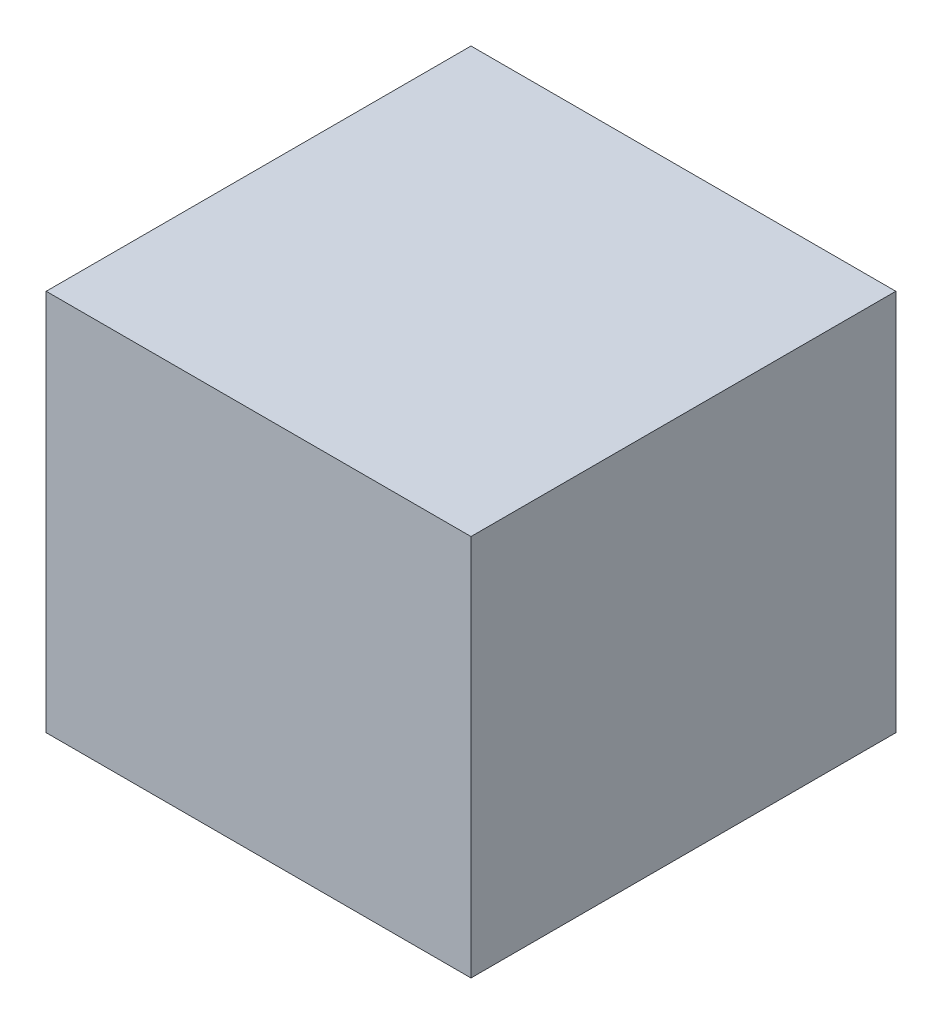
ISO-10303-21;
HEADER;
FILE_DESCRIPTION(('STEP AP214'),'2;1');
FILE_NAME('part.step','',(''),(''),'','','');
FILE_SCHEMA(('AUTOMOTIVE_DESIGN { 1 0 10303 214 1 1 1 1 }'));
ENDSEC;
DATA;
#1=APPLICATION_CONTEXT('core data for automotive mechanical design processes');
#2=APPLICATION_PROTOCOL_DEFINITION('international standard','automotive_design',2000,#1);
#3=PRODUCT_CONTEXT('',#1,'mechanical');
#4=PRODUCT('Part','Part','',(#3));
#5=PRODUCT_RELATED_PRODUCT_CATEGORY('part','',(#4));
#6=PRODUCT_DEFINITION_FORMATION('','',#4);
#7=PRODUCT_DEFINITION_CONTEXT('part definition',#1,'design');
#8=PRODUCT_DEFINITION('design','',#6,#7);
#9=PRODUCT_DEFINITION_SHAPE('','',#8);
#10=(LENGTH_UNIT() NAMED_UNIT(*) SI_UNIT(.MILLI.,.METRE.));
#11=(NAMED_UNIT(*) PLANE_ANGLE_UNIT() SI_UNIT($,.RADIAN.));
#12=(NAMED_UNIT(*) SI_UNIT($,.STERADIAN.) SOLID_ANGLE_UNIT());
#13=UNCERTAINTY_MEASURE_WITH_UNIT(LENGTH_MEASURE(1.E-05),#10,'distance_accuracy_value','');
#14=(GEOMETRIC_REPRESENTATION_CONTEXT(3) GLOBAL_UNCERTAINTY_ASSIGNED_CONTEXT((#13)) GLOBAL_UNIT_ASSIGNED_CONTEXT((#10,
#11,#12)) REPRESENTATION_CONTEXT('',''));
#15=CARTESIAN_POINT('',(0.,0.,0.));
#16=DIRECTION('',(0.,0.,1.));
#17=DIRECTION('',(1.,0.,0.));
#18=AXIS2_PLACEMENT_3D('',#15,#16,#17);
#19=CARTESIAN_POINT('',(2.5,4.5,-2.5));
#20=DIRECTION('',(-1.,0.,0.));
#21=DIRECTION('',(0.,0.,1.));
#22=AXIS2_PLACEMENT_3D('',#19,#20,#21);
#23=PLANE('',#22);
#24=DIRECTION('',(0.,0.,-1.));
#25=VECTOR('',#24,1.);
#26=CARTESIAN_POINT('',(2.5,0.,-2.5));
#27=LINE('',#26,#25);
#28=CARTESIAN_POINT('',(2.5,0.,2.5));
#29=VERTEX_POINT('',#28);
#30=CARTESIAN_POINT('',(2.5,0.,-2.5));
#31=VERTEX_POINT('',#30);
#32=EDGE_CURVE('E106',#29,#31,#27,.T.);
#33=ORIENTED_EDGE('',*,*,#32,.T.);
#34=DIRECTION('',(0.,-1.,0.));
#35=VECTOR('',#34,1.);
#36=CARTESIAN_POINT('',(2.5,4.5,-2.5));
#37=LINE('',#36,#35);
#38=CARTESIAN_POINT('',(2.5,4.5,-2.5));
#39=VERTEX_POINT('',#38);
#40=EDGE_CURVE('E11',#39,#31,#37,.T.);
#41=ORIENTED_EDGE('',*,*,#40,.F.);
#42=DIRECTION('',(0.,0.,-1.));
#43=VECTOR('',#42,1.);
#44=CARTESIAN_POINT('',(2.5,4.5,-2.5));
#45=LINE('',#44,#43);
#46=CARTESIAN_POINT('',(2.5,4.5,2.5));
#47=VERTEX_POINT('',#46);
#48=EDGE_CURVE('E94',#47,#39,#45,.T.);
#49=ORIENTED_EDGE('',*,*,#48,.F.);
#50=DIRECTION('',(0.,-1.,0.));
#51=VECTOR('',#50,1.);
#52=CARTESIAN_POINT('',(2.5,4.5,2.5));
#53=LINE('',#52,#51);
#54=EDGE_CURVE('E102',#47,#29,#53,.T.);
#55=ORIENTED_EDGE('',*,*,#54,.T.);
#56=EDGE_LOOP('',(#33,#41,#49,#55));
#57=FACE_BOUND('',#56,.T.);
#58=ADVANCED_FACE('F43',(#57),#23,.F.);
#59=CARTESIAN_POINT('',(-2.5,4.5,-2.5));
#60=DIRECTION('',(0.,0.,1.));
#61=DIRECTION('',(1.,0.,0.));
#62=AXIS2_PLACEMENT_3D('',#59,#60,#61);
#63=PLANE('',#62);
#64=DIRECTION('',(-1.,0.,0.));
#65=VECTOR('',#64,1.);
#66=CARTESIAN_POINT('',(-2.5,0.,-2.5));
#67=LINE('',#66,#65);
#68=CARTESIAN_POINT('',(-2.5,0.,-2.5));
#69=VERTEX_POINT('',#68);
#70=EDGE_CURVE('E98',#31,#69,#67,.T.);
#71=ORIENTED_EDGE('',*,*,#70,.T.);
#72=DIRECTION('',(0.,-1.,0.));
#73=VECTOR('',#72,1.);
#74=CARTESIAN_POINT('',(-2.5,4.5,-2.5));
#75=LINE('',#74,#73);
#76=CARTESIAN_POINT('',(-2.5,4.5,-2.5));
#77=VERTEX_POINT('',#76);
#78=EDGE_CURVE('E51',#77,#69,#75,.T.);
#79=ORIENTED_EDGE('',*,*,#78,.F.);
#80=DIRECTION('',(-1.,0.,0.));
#81=VECTOR('',#80,1.);
#82=CARTESIAN_POINT('',(-2.5,4.5,-2.5));
#83=LINE('',#82,#81);
#84=EDGE_CURVE('E89',#39,#77,#83,.T.);
#85=ORIENTED_EDGE('',*,*,#84,.F.);
#86=ORIENTED_EDGE('',*,*,#40,.T.);
#87=EDGE_LOOP('',(#71,#79,#85,#86));
#88=FACE_BOUND('',#87,.T.);
#89=ADVANCED_FACE('F97',(#88),#63,.F.);
#90=CARTESIAN_POINT('',(-2.5,4.5,-2.5));
#91=DIRECTION('',(1.,0.,0.));
#92=DIRECTION('',(0.,0.,-1.));
#93=AXIS2_PLACEMENT_3D('',#90,#91,#92);
#94=PLANE('',#93);
#95=DIRECTION('',(0.,0.,1.));
#96=VECTOR('',#95,1.);
#97=CARTESIAN_POINT('',(-2.5,0.,-2.5));
#98=LINE('',#97,#96);
#99=CARTESIAN_POINT('',(-2.5,0.,2.5));
#100=VERTEX_POINT('',#99);
#101=EDGE_CURVE('E76',#69,#100,#98,.T.);
#102=ORIENTED_EDGE('',*,*,#101,.T.);
#103=DIRECTION('',(0.,-1.,0.));
#104=VECTOR('',#103,1.);
#105=CARTESIAN_POINT('',(-2.5,4.5,2.5));
#106=LINE('',#105,#104);
#107=CARTESIAN_POINT('',(-2.5,4.5,2.5));
#108=VERTEX_POINT('',#107);
#109=EDGE_CURVE('E99',#108,#100,#106,.T.);
#110=ORIENTED_EDGE('',*,*,#109,.F.);
#111=DIRECTION('',(0.,0.,1.));
#112=VECTOR('',#111,1.);
#113=CARTESIAN_POINT('',(-2.5,4.5,-2.5));
#114=LINE('',#113,#112);
#115=EDGE_CURVE('E92',#77,#108,#114,.T.);
#116=ORIENTED_EDGE('',*,*,#115,.F.);
#117=ORIENTED_EDGE('',*,*,#78,.T.);
#118=EDGE_LOOP('',(#102,#110,#116,#117));
#119=FACE_BOUND('',#118,.T.);
#120=ADVANCED_FACE('F100',(#119),#94,.F.);
#121=CARTESIAN_POINT('',(-2.5,4.5,2.5));
#122=DIRECTION('',(0.,0.,-1.));
#123=DIRECTION('',(-1.,0.,0.));
#124=AXIS2_PLACEMENT_3D('',#121,#122,#123);
#125=PLANE('',#124);
#126=DIRECTION('',(1.,0.,0.));
#127=VECTOR('',#126,1.);
#128=CARTESIAN_POINT('',(-2.5,0.,2.5));
#129=LINE('',#128,#127);
#130=EDGE_CURVE('E82',#100,#29,#129,.T.);
#131=ORIENTED_EDGE('',*,*,#130,.T.);
#132=ORIENTED_EDGE('',*,*,#54,.F.);
#133=DIRECTION('',(1.,0.,0.));
#134=VECTOR('',#133,1.);
#135=CARTESIAN_POINT('',(-2.5,4.5,2.5));
#136=LINE('',#135,#134);
#137=EDGE_CURVE('E59',#108,#47,#136,.T.);
#138=ORIENTED_EDGE('',*,*,#137,.F.);
#139=ORIENTED_EDGE('',*,*,#109,.T.);
#140=EDGE_LOOP('',(#131,#132,#138,#139));
#141=FACE_BOUND('',#140,.T.);
#142=ADVANCED_FACE('F113',(#141),#125,.F.);
#143=CARTESIAN_POINT('',(0.,4.5,0.));
#144=DIRECTION('',(0.,1.,0.));
#145=DIRECTION('',(0.,0.,1.));
#146=AXIS2_PLACEMENT_3D('',#143,#144,#145);
#147=PLANE('',#146);
#148=ORIENTED_EDGE('',*,*,#48,.T.);
#149=ORIENTED_EDGE('',*,*,#84,.T.);
#150=ORIENTED_EDGE('',*,*,#115,.T.);
#151=ORIENTED_EDGE('',*,*,#137,.T.);
#152=EDGE_LOOP('',(#148,#149,#150,#151));
#153=FACE_BOUND('',#152,.T.);
#154=ADVANCED_FACE('F90',(#153),#147,.T.);
#155=CARTESIAN_POINT('',(0.,0.,0.));
#156=DIRECTION('',(0.,1.,0.));
#157=DIRECTION('',(0.,0.,1.));
#158=AXIS2_PLACEMENT_3D('',#155,#156,#157);
#159=PLANE('',#158);
#160=ORIENTED_EDGE('',*,*,#32,.F.);
#161=ORIENTED_EDGE('',*,*,#130,.F.);
#162=ORIENTED_EDGE('',*,*,#101,.F.);
#163=ORIENTED_EDGE('',*,*,#70,.F.);
#164=EDGE_LOOP('',(#160,#161,#162,#163));
#165=FACE_BOUND('',#164,.T.);
#166=ADVANCED_FACE('F116',(#165),#159,.F.);
#167=CLOSED_SHELL('',(#58,#89,#120,#142,#154,#166));
#168=MANIFOLD_SOLID_BREP('B2',#167);
#169=ADVANCED_BREP_SHAPE_REPRESENTATION('',(#18,#168),#14);
#170=SHAPE_DEFINITION_REPRESENTATION(#9,#169);
ENDSEC;
END-ISO-10303-21;
